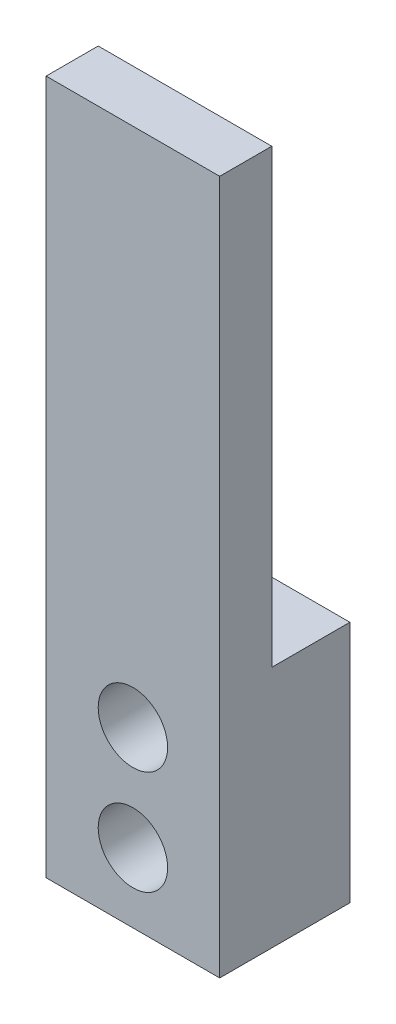
ISO-10303-21;
HEADER;
FILE_DESCRIPTION(('STEP AP214'),'2;1');
FILE_NAME('part.step','',(''),(''),'','','');
FILE_SCHEMA(('AUTOMOTIVE_DESIGN { 1 0 10303 214 1 1 1 1 }'));
ENDSEC;
DATA;
#1=APPLICATION_CONTEXT('core data for automotive mechanical design processes');
#2=APPLICATION_PROTOCOL_DEFINITION('international standard','automotive_design',2000,#1);
#3=PRODUCT_CONTEXT('',#1,'mechanical');
#4=PRODUCT('Part','Part','',(#3));
#5=PRODUCT_RELATED_PRODUCT_CATEGORY('part','',(#4));
#6=PRODUCT_DEFINITION_FORMATION('','',#4);
#7=PRODUCT_DEFINITION_CONTEXT('part definition',#1,'design');
#8=PRODUCT_DEFINITION('design','',#6,#7);
#9=PRODUCT_DEFINITION_SHAPE('','',#8);
#10=(LENGTH_UNIT() NAMED_UNIT(*) SI_UNIT(.MILLI.,.METRE.));
#11=(NAMED_UNIT(*) PLANE_ANGLE_UNIT() SI_UNIT($,.RADIAN.));
#12=(NAMED_UNIT(*) SI_UNIT($,.STERADIAN.) SOLID_ANGLE_UNIT());
#13=UNCERTAINTY_MEASURE_WITH_UNIT(LENGTH_MEASURE(1.E-05),#10,'distance_accuracy_value','');
#14=(GEOMETRIC_REPRESENTATION_CONTEXT(3) GLOBAL_UNCERTAINTY_ASSIGNED_CONTEXT((#13)) GLOBAL_UNIT_ASSIGNED_CONTEXT((#10,
#11,#12)) REPRESENTATION_CONTEXT('',''));
#15=CARTESIAN_POINT('',(0.,0.,0.));
#16=DIRECTION('',(0.,0.,1.));
#17=DIRECTION('',(1.,0.,0.));
#18=AXIS2_PLACEMENT_3D('',#15,#16,#17);
#19=CARTESIAN_POINT('',(-2.5,0.,3.75));
#20=DIRECTION('',(0.,-1.,0.));
#21=DIRECTION('',(0.,0.,-1.));
#22=AXIS2_PLACEMENT_3D('',#19,#20,#21);
#23=PLANE('',#22);
#24=DIRECTION('',(1.,0.,0.));
#25=VECTOR('',#24,1.);
#26=CARTESIAN_POINT('',(2.5,0.,2.25));
#27=LINE('',#26,#25);
#28=CARTESIAN_POINT('',(-2.5,0.,2.25));
#29=VERTEX_POINT('',#28);
#30=CARTESIAN_POINT('',(2.5,0.,2.25));
#31=VERTEX_POINT('',#30);
#32=EDGE_CURVE('E103',#29,#31,#27,.T.);
#33=ORIENTED_EDGE('',*,*,#32,.F.);
#34=DIRECTION('',(0.,0.,-1.));
#35=VECTOR('',#34,1.);
#36=CARTESIAN_POINT('',(-2.5,0.,3.75));
#37=LINE('',#36,#35);
#38=CARTESIAN_POINT('',(-2.5,0.,3.75));
#39=VERTEX_POINT('',#38);
#40=EDGE_CURVE('E125',#39,#29,#37,.T.);
#41=ORIENTED_EDGE('',*,*,#40,.F.);
#42=DIRECTION('',(-1.,0.,0.));
#43=VECTOR('',#42,1.);
#44=CARTESIAN_POINT('',(-2.5,0.,3.75));
#45=LINE('',#44,#43);
#46=CARTESIAN_POINT('',(2.5,0.,3.75));
#47=VERTEX_POINT('',#46);
#48=EDGE_CURVE('E56',#47,#39,#45,.T.);
#49=ORIENTED_EDGE('',*,*,#48,.F.);
#50=DIRECTION('',(0.,0.,-1.));
#51=VECTOR('',#50,1.);
#52=CARTESIAN_POINT('',(2.5,0.,3.75));
#53=LINE('',#52,#51);
#54=EDGE_CURVE('E131',#47,#31,#53,.T.);
#55=ORIENTED_EDGE('',*,*,#54,.T.);
#56=EDGE_LOOP('',(#33,#41,#49,#55));
#57=FACE_BOUND('',#56,.T.);
#58=ADVANCED_FACE('F32',(#57),#23,.F.);
#59=CARTESIAN_POINT('',(-2.5,0.,3.75));
#60=DIRECTION('',(1.,0.,0.));
#61=DIRECTION('',(0.,1.,0.));
#62=AXIS2_PLACEMENT_3D('',#59,#60,#61);
#63=PLANE('',#62);
#64=DIRECTION('',(0.,1.,0.));
#65=VECTOR('',#64,1.);
#66=CARTESIAN_POINT('',(-2.5,0.,2.25));
#67=LINE('',#66,#65);
#68=CARTESIAN_POINT('',(-2.5,-13.,2.25));
#69=VERTEX_POINT('',#68);
#70=EDGE_CURVE('E97',#69,#29,#67,.T.);
#71=ORIENTED_EDGE('',*,*,#70,.F.);
#72=DIRECTION('',(0.,0.,-1.));
#73=VECTOR('',#72,1.);
#74=CARTESIAN_POINT('',(-2.5,-13.,2.25));
#75=LINE('',#74,#73);
#76=CARTESIAN_POINT('',(-2.5,-13.,0.));
#77=VERTEX_POINT('',#76);
#78=EDGE_CURVE('E94',#69,#77,#75,.T.);
#79=ORIENTED_EDGE('',*,*,#78,.T.);
#80=DIRECTION('',(0.,-1.,0.));
#81=VECTOR('',#80,1.);
#82=CARTESIAN_POINT('',(-2.5,0.,0.));
#83=LINE('',#82,#81);
#84=CARTESIAN_POINT('',(-2.5,-20.,0.));
#85=VERTEX_POINT('',#84);
#86=EDGE_CURVE('E114',#77,#85,#83,.T.);
#87=ORIENTED_EDGE('',*,*,#86,.T.);
#88=DIRECTION('',(0.,0.,-1.));
#89=VECTOR('',#88,1.);
#90=CARTESIAN_POINT('',(-2.5,-20.,3.75));
#91=LINE('',#90,#89);
#92=CARTESIAN_POINT('',(-2.5,-20.,3.75));
#93=VERTEX_POINT('',#92);
#94=EDGE_CURVE('E11',#93,#85,#91,.T.);
#95=ORIENTED_EDGE('',*,*,#94,.F.);
#96=DIRECTION('',(0.,-1.,0.));
#97=VECTOR('',#96,1.);
#98=CARTESIAN_POINT('',(-2.5,0.,3.75));
#99=LINE('',#98,#97);
#100=EDGE_CURVE('E119',#39,#93,#99,.T.);
#101=ORIENTED_EDGE('',*,*,#100,.F.);
#102=ORIENTED_EDGE('',*,*,#40,.T.);
#103=EDGE_LOOP('',(#71,#79,#87,#95,#101,#102));
#104=FACE_BOUND('',#103,.T.);
#105=ADVANCED_FACE('F34',(#104),#63,.F.);
#106=CARTESIAN_POINT('',(-2.5,-20.,3.75));
#107=DIRECTION('',(0.,1.,0.));
#108=DIRECTION('',(0.,0.,1.));
#109=AXIS2_PLACEMENT_3D('',#106,#107,#108);
#110=PLANE('',#109);
#111=DIRECTION('',(1.,0.,0.));
#112=VECTOR('',#111,1.);
#113=CARTESIAN_POINT('',(-2.5,-20.,0.));
#114=LINE('',#113,#112);
#115=CARTESIAN_POINT('',(2.5,-20.,0.));
#116=VERTEX_POINT('',#115);
#117=EDGE_CURVE('E71',#85,#116,#114,.T.);
#118=ORIENTED_EDGE('',*,*,#117,.T.);
#119=DIRECTION('',(0.,0.,-1.));
#120=VECTOR('',#119,1.);
#121=CARTESIAN_POINT('',(2.5,-20.,3.75));
#122=LINE('',#121,#120);
#123=CARTESIAN_POINT('',(2.5,-20.,3.75));
#124=VERTEX_POINT('',#123);
#125=EDGE_CURVE('E40',#124,#116,#122,.T.);
#126=ORIENTED_EDGE('',*,*,#125,.F.);
#127=DIRECTION('',(1.,0.,0.));
#128=VECTOR('',#127,1.);
#129=CARTESIAN_POINT('',(-2.5,-20.,3.75));
#130=LINE('',#129,#128);
#131=EDGE_CURVE('E76',#93,#124,#130,.T.);
#132=ORIENTED_EDGE('',*,*,#131,.F.);
#133=ORIENTED_EDGE('',*,*,#94,.T.);
#134=EDGE_LOOP('',(#118,#126,#132,#133));
#135=FACE_BOUND('',#134,.T.);
#136=ADVANCED_FACE('F172',(#135),#110,.F.);
#137=CARTESIAN_POINT('',(2.5,0.,3.75));
#138=DIRECTION('',(-1.,0.,0.));
#139=DIRECTION('',(0.,-1.,0.));
#140=AXIS2_PLACEMENT_3D('',#137,#138,#139);
#141=PLANE('',#140);
#142=DIRECTION('',(0.,1.,0.));
#143=VECTOR('',#142,1.);
#144=CARTESIAN_POINT('',(2.5,0.,0.));
#145=LINE('',#144,#143);
#146=CARTESIAN_POINT('',(2.5,-13.,0.));
#147=VERTEX_POINT('',#146);
#148=EDGE_CURVE('E112',#116,#147,#145,.T.);
#149=ORIENTED_EDGE('',*,*,#148,.T.);
#150=DIRECTION('',(0.,0.,-1.));
#151=VECTOR('',#150,1.);
#152=CARTESIAN_POINT('',(2.5,-13.,2.25));
#153=LINE('',#152,#151);
#154=CARTESIAN_POINT('',(2.5,-13.,2.25));
#155=VERTEX_POINT('',#154);
#156=EDGE_CURVE('E47',#155,#147,#153,.T.);
#157=ORIENTED_EDGE('',*,*,#156,.F.);
#158=DIRECTION('',(0.,-1.,0.));
#159=VECTOR('',#158,1.);
#160=CARTESIAN_POINT('',(2.5,0.,2.25));
#161=LINE('',#160,#159);
#162=EDGE_CURVE('E98',#31,#155,#161,.T.);
#163=ORIENTED_EDGE('',*,*,#162,.F.);
#164=ORIENTED_EDGE('',*,*,#54,.F.);
#165=DIRECTION('',(0.,1.,0.));
#166=VECTOR('',#165,1.);
#167=CARTESIAN_POINT('',(2.5,0.,3.75));
#168=LINE('',#167,#166);
#169=EDGE_CURVE('E122',#124,#47,#168,.T.);
#170=ORIENTED_EDGE('',*,*,#169,.F.);
#171=ORIENTED_EDGE('',*,*,#125,.T.);
#172=EDGE_LOOP('',(#149,#157,#163,#164,#170,#171));
#173=FACE_BOUND('',#172,.T.);
#174=ADVANCED_FACE('F110',(#173),#141,.F.);
#175=CARTESIAN_POINT('',(-2.5,-20.,3.75));
#176=DIRECTION('',(0.,0.,1.));
#177=DIRECTION('',(1.,0.,0.));
#178=AXIS2_PLACEMENT_3D('',#175,#176,#177);
#179=PLANE('',#178);
#180=CARTESIAN_POINT('',(0.,-15.,3.75));
#181=DIRECTION('',(0.,0.,1.));
#182=DIRECTION('',(1.,0.,0.));
#183=AXIS2_PLACEMENT_3D('',#180,#181,#182);
#184=CIRCLE('',#183,1.);
#185=CARTESIAN_POINT('',(1.,-15.,3.75));
#186=VERTEX_POINT('',#185);
#187=EDGE_CURVE('E144',#186,#186,#184,.F.);
#188=ORIENTED_EDGE('',*,*,#187,.T.);
#189=EDGE_LOOP('',(#188));
#190=FACE_BOUND('',#189,.T.);
#191=CARTESIAN_POINT('',(0.,-18.,3.75));
#192=DIRECTION('',(0.,0.,1.));
#193=DIRECTION('',(1.,0.,0.));
#194=AXIS2_PLACEMENT_3D('',#191,#192,#193);
#195=CIRCLE('',#194,1.);
#196=CARTESIAN_POINT('',(0.999999999999997,-18.,3.75));
#197=VERTEX_POINT('',#196);
#198=EDGE_CURVE('E136',#197,#197,#195,.F.);
#199=ORIENTED_EDGE('',*,*,#198,.T.);
#200=EDGE_LOOP('',(#199));
#201=FACE_BOUND('',#200,.T.);
#202=ORIENTED_EDGE('',*,*,#100,.T.);
#203=ORIENTED_EDGE('',*,*,#131,.T.);
#204=ORIENTED_EDGE('',*,*,#169,.T.);
#205=ORIENTED_EDGE('',*,*,#48,.T.);
#206=EDGE_LOOP('',(#202,#203,#204,#205));
#207=FACE_BOUND('',#206,.T.);
#208=ADVANCED_FACE('F156',(#190,#201,#207),#179,.T.);
#209=CARTESIAN_POINT('',(-2.5,-20.,0.));
#210=DIRECTION('',(0.,0.,1.));
#211=DIRECTION('',(1.,0.,0.));
#212=AXIS2_PLACEMENT_3D('',#209,#210,#211);
#213=PLANE('',#212);
#214=CARTESIAN_POINT('',(0.,-15.,0.));
#215=DIRECTION('',(0.,0.,-1.));
#216=DIRECTION('',(-1.,0.,0.));
#217=AXIS2_PLACEMENT_3D('',#214,#215,#216);
#218=CIRCLE('',#217,1.);
#219=CARTESIAN_POINT('',(-1.,-15.,0.));
#220=VERTEX_POINT('',#219);
#221=EDGE_CURVE('E147',#220,#220,#218,.T.);
#222=ORIENTED_EDGE('',*,*,#221,.F.);
#223=EDGE_LOOP('',(#222));
#224=FACE_BOUND('',#223,.T.);
#225=CARTESIAN_POINT('',(0.,-18.,0.));
#226=DIRECTION('',(0.,0.,-1.));
#227=DIRECTION('',(-1.,0.,0.));
#228=AXIS2_PLACEMENT_3D('',#225,#226,#227);
#229=CIRCLE('',#228,1.);
#230=CARTESIAN_POINT('',(-1.00000000000001,-18.,0.));
#231=VERTEX_POINT('',#230);
#232=EDGE_CURVE('E138',#231,#231,#229,.T.);
#233=ORIENTED_EDGE('',*,*,#232,.F.);
#234=EDGE_LOOP('',(#233));
#235=FACE_BOUND('',#234,.T.);
#236=ORIENTED_EDGE('',*,*,#86,.F.);
#237=DIRECTION('',(-1.,0.,0.));
#238=VECTOR('',#237,1.);
#239=CARTESIAN_POINT('',(2.5,-13.,0.));
#240=LINE('',#239,#238);
#241=EDGE_CURVE('E107',#147,#77,#240,.T.);
#242=ORIENTED_EDGE('',*,*,#241,.F.);
#243=ORIENTED_EDGE('',*,*,#148,.F.);
#244=ORIENTED_EDGE('',*,*,#117,.F.);
#245=EDGE_LOOP('',(#236,#242,#243,#244));
#246=FACE_BOUND('',#245,.T.);
#247=ADVANCED_FACE('F135',(#224,#235,#246),#213,.F.);
#248=CARTESIAN_POINT('',(2.5,-13.,2.25));
#249=DIRECTION('',(0.,-1.,0.));
#250=DIRECTION('',(0.,0.,-1.));
#251=AXIS2_PLACEMENT_3D('',#248,#249,#250);
#252=PLANE('',#251);
#253=ORIENTED_EDGE('',*,*,#241,.T.);
#254=ORIENTED_EDGE('',*,*,#78,.F.);
#255=DIRECTION('',(-1.,0.,0.));
#256=VECTOR('',#255,1.);
#257=CARTESIAN_POINT('',(2.5,-13.,2.25));
#258=LINE('',#257,#256);
#259=EDGE_CURVE('E90',#155,#69,#258,.T.);
#260=ORIENTED_EDGE('',*,*,#259,.F.);
#261=ORIENTED_EDGE('',*,*,#156,.T.);
#262=EDGE_LOOP('',(#253,#254,#260,#261));
#263=FACE_BOUND('',#262,.T.);
#264=ADVANCED_FACE('F92',(#263),#252,.F.);
#265=CARTESIAN_POINT('',(2.5,-13.,2.25));
#266=DIRECTION('',(0.,0.,-1.));
#267=DIRECTION('',(-1.,0.,0.));
#268=AXIS2_PLACEMENT_3D('',#265,#266,#267);
#269=PLANE('',#268);
#270=ORIENTED_EDGE('',*,*,#162,.T.);
#271=ORIENTED_EDGE('',*,*,#259,.T.);
#272=ORIENTED_EDGE('',*,*,#70,.T.);
#273=ORIENTED_EDGE('',*,*,#32,.T.);
#274=EDGE_LOOP('',(#270,#271,#272,#273));
#275=FACE_BOUND('',#274,.T.);
#276=ADVANCED_FACE('F101',(#275),#269,.T.);
#277=CARTESIAN_POINT('',(0.,-18.,6.5784271247462));
#278=DIRECTION('',(0.,0.,-1.));
#279=DIRECTION('',(-1.,0.,0.));
#280=AXIS2_PLACEMENT_3D('',#277,#278,#279);
#281=CYLINDRICAL_SURFACE('',#280,1.);
#282=ORIENTED_EDGE('',*,*,#232,.T.);
#283=EDGE_LOOP('',(#282));
#284=FACE_BOUND('',#283,.T.);
#285=ORIENTED_EDGE('',*,*,#198,.F.);
#286=EDGE_LOOP('',(#285));
#287=FACE_BOUND('',#286,.T.);
#288=ADVANCED_FACE('F160',(#284,#287),#281,.F.);
#289=CARTESIAN_POINT('',(0.,-15.,6.5784271247462));
#290=DIRECTION('',(0.,0.,-1.));
#291=DIRECTION('',(-1.,0.,0.));
#292=AXIS2_PLACEMENT_3D('',#289,#290,#291);
#293=CYLINDRICAL_SURFACE('',#292,1.);
#294=ORIENTED_EDGE('',*,*,#221,.T.);
#295=EDGE_LOOP('',(#294));
#296=FACE_BOUND('',#295,.T.);
#297=ORIENTED_EDGE('',*,*,#187,.F.);
#298=EDGE_LOOP('',(#297));
#299=FACE_BOUND('',#298,.T.);
#300=ADVANCED_FACE('F151',(#296,#299),#293,.F.);
#301=CLOSED_SHELL('',(#58,#105,#136,#174,#208,#247,#264,#276,#288,#300));
#302=MANIFOLD_SOLID_BREP('B2',#301);
#303=ADVANCED_BREP_SHAPE_REPRESENTATION('',(#18,#302),#14);
#304=SHAPE_DEFINITION_REPRESENTATION(#9,#303);
ENDSEC;
END-ISO-10303-21;
